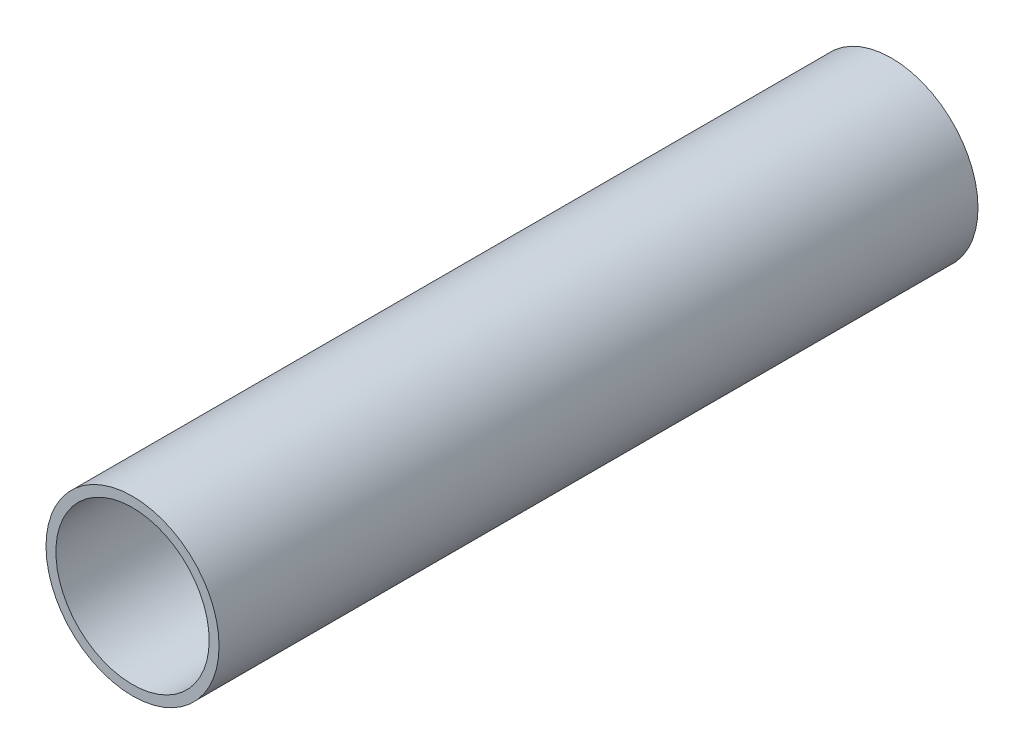
ISO-10303-21;
HEADER;
FILE_DESCRIPTION(('STEP AP214'),'2;1');
FILE_NAME('part.step','',(''),(''),'','','');
FILE_SCHEMA(('AUTOMOTIVE_DESIGN { 1 0 10303 214 1 1 1 1 }'));
ENDSEC;
DATA;
#1=APPLICATION_CONTEXT('core data for automotive mechanical design processes');
#2=APPLICATION_PROTOCOL_DEFINITION('international standard','automotive_design',2000,#1);
#3=PRODUCT_CONTEXT('',#1,'mechanical');
#4=PRODUCT('Part','Part','',(#3));
#5=PRODUCT_RELATED_PRODUCT_CATEGORY('part','',(#4));
#6=PRODUCT_DEFINITION_FORMATION('','',#4);
#7=PRODUCT_DEFINITION_CONTEXT('part definition',#1,'design');
#8=PRODUCT_DEFINITION('design','',#6,#7);
#9=PRODUCT_DEFINITION_SHAPE('','',#8);
#10=(LENGTH_UNIT() NAMED_UNIT(*) SI_UNIT(.MILLI.,.METRE.));
#11=(NAMED_UNIT(*) PLANE_ANGLE_UNIT() SI_UNIT($,.RADIAN.));
#12=(NAMED_UNIT(*) SI_UNIT($,.STERADIAN.) SOLID_ANGLE_UNIT());
#13=UNCERTAINTY_MEASURE_WITH_UNIT(LENGTH_MEASURE(1.E-05),#10,'distance_accuracy_value','');
#14=(GEOMETRIC_REPRESENTATION_CONTEXT(3) GLOBAL_UNCERTAINTY_ASSIGNED_CONTEXT((#13)) GLOBAL_UNIT_ASSIGNED_CONTEXT((#10,
#11,#12)) REPRESENTATION_CONTEXT('',''));
#15=CARTESIAN_POINT('',(0.,0.,0.));
#16=DIRECTION('',(0.,0.,1.));
#17=DIRECTION('',(1.,0.,0.));
#18=AXIS2_PLACEMENT_3D('',#15,#16,#17);
#19=CARTESIAN_POINT('',(0.,0.,500.));
#20=DIRECTION('',(0.,0.,1.));
#21=DIRECTION('',(1.,0.,0.));
#22=AXIS2_PLACEMENT_3D('',#19,#20,#21);
#23=PLANE('',#22);
#24=CARTESIAN_POINT('',(0.,0.,500.));
#25=DIRECTION('',(0.,0.,1.));
#26=DIRECTION('',(1.,0.,0.));
#27=AXIS2_PLACEMENT_3D('',#24,#25,#26);
#28=CIRCLE('',#27,57.);
#29=CARTESIAN_POINT('',(57.,0.,500.));
#30=VERTEX_POINT('',#29);
#31=EDGE_CURVE('E10',#30,#30,#28,.T.);
#32=ORIENTED_EDGE('',*,*,#31,.T.);
#33=EDGE_LOOP('',(#32));
#34=FACE_BOUND('',#33,.T.);
#35=CARTESIAN_POINT('',(0.,0.,500.));
#36=DIRECTION('',(0.,0.,1.));
#37=DIRECTION('',(1.,0.,0.));
#38=AXIS2_PLACEMENT_3D('',#35,#36,#37);
#39=CIRCLE('',#38,50.5);
#40=CARTESIAN_POINT('',(50.5,0.,500.));
#41=VERTEX_POINT('',#40);
#42=EDGE_CURVE('E43',#41,#41,#39,.T.);
#43=ORIENTED_EDGE('',*,*,#42,.F.);
#44=EDGE_LOOP('',(#43));
#45=FACE_BOUND('',#44,.T.);
#46=ADVANCED_FACE('F32',(#34,#45),#23,.T.);
#47=CARTESIAN_POINT('',(0.,0.,0.));
#48=DIRECTION('',(0.,0.,1.));
#49=DIRECTION('',(1.,0.,0.));
#50=AXIS2_PLACEMENT_3D('',#47,#48,#49);
#51=PLANE('',#50);
#52=CARTESIAN_POINT('',(0.,0.,0.));
#53=DIRECTION('',(0.,0.,1.));
#54=DIRECTION('',(1.,0.,0.));
#55=AXIS2_PLACEMENT_3D('',#52,#53,#54);
#56=CIRCLE('',#55,57.);
#57=CARTESIAN_POINT('',(57.,0.,0.));
#58=VERTEX_POINT('',#57);
#59=EDGE_CURVE('E36',#58,#58,#56,.T.);
#60=ORIENTED_EDGE('',*,*,#59,.F.);
#61=EDGE_LOOP('',(#60));
#62=FACE_BOUND('',#61,.T.);
#63=CARTESIAN_POINT('',(0.,0.,0.));
#64=DIRECTION('',(0.,0.,1.));
#65=DIRECTION('',(1.,0.,0.));
#66=AXIS2_PLACEMENT_3D('',#63,#64,#65);
#67=CIRCLE('',#66,50.5);
#68=CARTESIAN_POINT('',(50.5,0.,0.));
#69=VERTEX_POINT('',#68);
#70=EDGE_CURVE('E45',#69,#69,#67,.T.);
#71=ORIENTED_EDGE('',*,*,#70,.T.);
#72=EDGE_LOOP('',(#71));
#73=FACE_BOUND('',#72,.T.);
#74=ADVANCED_FACE('F55',(#62,#73),#51,.F.);
#75=CARTESIAN_POINT('',(0.,0.,500.));
#76=DIRECTION('',(0.,0.,-1.));
#77=DIRECTION('',(-1.,0.,0.));
#78=AXIS2_PLACEMENT_3D('',#75,#76,#77);
#79=CYLINDRICAL_SURFACE('',#78,57.);
#80=ORIENTED_EDGE('',*,*,#31,.F.);
#81=EDGE_LOOP('',(#80));
#82=FACE_BOUND('',#81,.T.);
#83=ORIENTED_EDGE('',*,*,#59,.T.);
#84=EDGE_LOOP('',(#83));
#85=FACE_BOUND('',#84,.T.);
#86=ADVANCED_FACE('F34',(#82,#85),#79,.T.);
#87=CARTESIAN_POINT('',(0.,0.,500.));
#88=DIRECTION('',(0.,0.,-1.));
#89=DIRECTION('',(-1.,0.,0.));
#90=AXIS2_PLACEMENT_3D('',#87,#88,#89);
#91=CYLINDRICAL_SURFACE('',#90,50.5);
#92=ORIENTED_EDGE('',*,*,#42,.T.);
#93=EDGE_LOOP('',(#92));
#94=FACE_BOUND('',#93,.T.);
#95=ORIENTED_EDGE('',*,*,#70,.F.);
#96=EDGE_LOOP('',(#95));
#97=FACE_BOUND('',#96,.T.);
#98=ADVANCED_FACE('F51',(#94,#97),#91,.F.);
#99=CLOSED_SHELL('',(#46,#74,#86,#98));
#100=MANIFOLD_SOLID_BREP('B2',#99);
#101=ADVANCED_BREP_SHAPE_REPRESENTATION('',(#18,#100),#14);
#102=SHAPE_DEFINITION_REPRESENTATION(#9,#101);
ENDSEC;
END-ISO-10303-21;
